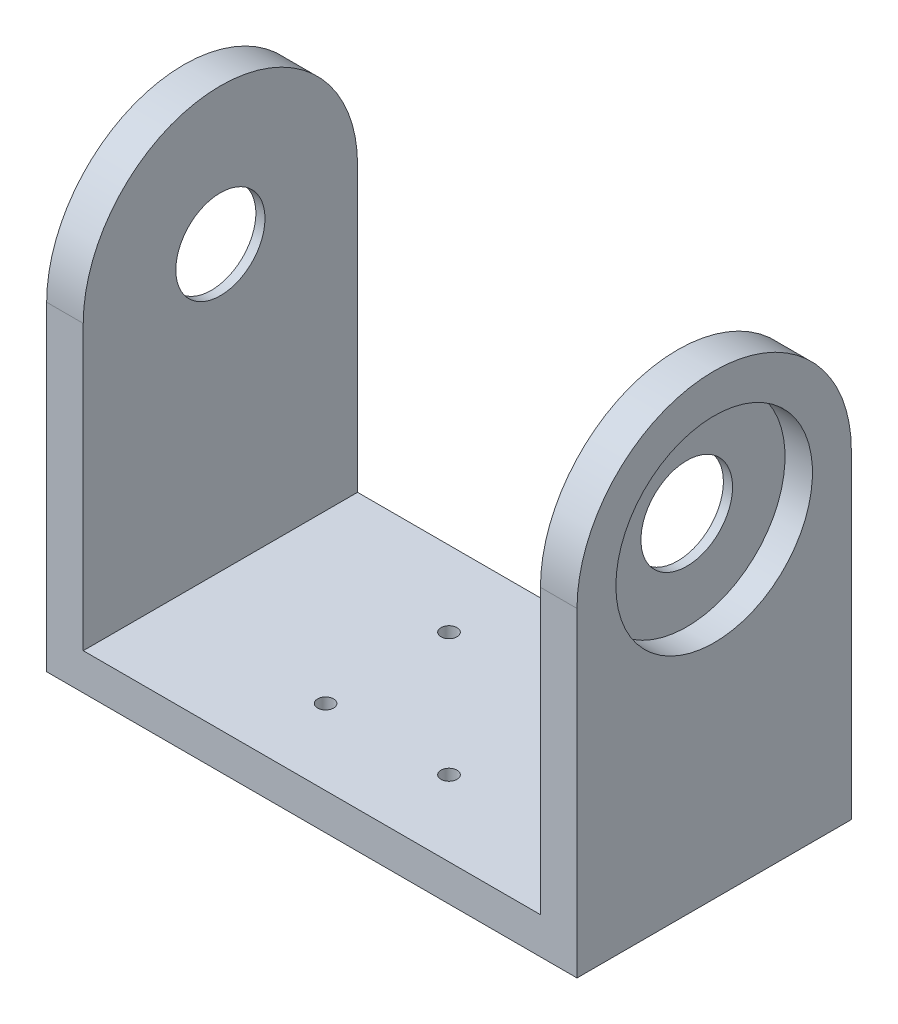
ISO-10303-21;
HEADER;
FILE_DESCRIPTION(('STEP AP214'),'2;1');
FILE_NAME('part.step','',(''),(''),'','','');
FILE_SCHEMA(('AUTOMOTIVE_DESIGN { 1 0 10303 214 1 1 1 1 }'));
ENDSEC;
DATA;
#1=APPLICATION_CONTEXT('core data for automotive mechanical design processes');
#2=APPLICATION_PROTOCOL_DEFINITION('international standard','automotive_design',2000,#1);
#3=PRODUCT_CONTEXT('',#1,'mechanical');
#4=PRODUCT('Part','Part','',(#3));
#5=PRODUCT_RELATED_PRODUCT_CATEGORY('part','',(#4));
#6=PRODUCT_DEFINITION_FORMATION('','',#4);
#7=PRODUCT_DEFINITION_CONTEXT('part definition',#1,'design');
#8=PRODUCT_DEFINITION('design','',#6,#7);
#9=PRODUCT_DEFINITION_SHAPE('','',#8);
#10=(LENGTH_UNIT() NAMED_UNIT(*) SI_UNIT(.MILLI.,.METRE.));
#11=(NAMED_UNIT(*) PLANE_ANGLE_UNIT() SI_UNIT($,.RADIAN.));
#12=(NAMED_UNIT(*) SI_UNIT($,.STERADIAN.) SOLID_ANGLE_UNIT());
#13=UNCERTAINTY_MEASURE_WITH_UNIT(LENGTH_MEASURE(1.E-05),#10,'distance_accuracy_value','');
#14=(GEOMETRIC_REPRESENTATION_CONTEXT(3) GLOBAL_UNCERTAINTY_ASSIGNED_CONTEXT((#13)) GLOBAL_UNIT_ASSIGNED_CONTEXT((#10,
#11,#12)) REPRESENTATION_CONTEXT('',''));
#15=CARTESIAN_POINT('',(0.,0.,0.));
#16=DIRECTION('',(0.,0.,1.));
#17=DIRECTION('',(1.,0.,0.));
#18=AXIS2_PLACEMENT_3D('',#15,#16,#17);
#19=CARTESIAN_POINT('',(29.,35.,0.));
#20=DIRECTION('',(-1.,0.,0.));
#21=DIRECTION('',(0.,0.,1.));
#22=AXIS2_PLACEMENT_3D('',#19,#20,#21);
#23=CYLINDRICAL_SURFACE('',#22,10.75);
#24=CARTESIAN_POINT('',(29.,35.,0.));
#25=DIRECTION('',(-1.,0.,0.));
#26=DIRECTION('',(0.,0.,1.));
#27=AXIS2_PLACEMENT_3D('',#24,#25,#26);
#28=CIRCLE('',#27,10.75);
#29=CARTESIAN_POINT('',(29.,35.,10.75));
#30=VERTEX_POINT('',#29);
#31=EDGE_CURVE('E151',#30,#30,#28,.T.);
#32=ORIENTED_EDGE('',*,*,#31,.F.);
#33=EDGE_LOOP('',(#32));
#34=FACE_BOUND('',#33,.T.);
#35=CARTESIAN_POINT('',(26.,35.,0.));
#36=DIRECTION('',(-1.,0.,0.));
#37=DIRECTION('',(0.,0.,1.));
#38=AXIS2_PLACEMENT_3D('',#35,#36,#37);
#39=CIRCLE('',#38,10.75);
#40=CARTESIAN_POINT('',(26.,35.,10.75));
#41=VERTEX_POINT('',#40);
#42=EDGE_CURVE('E11',#41,#41,#39,.F.);
#43=ORIENTED_EDGE('',*,*,#42,.F.);
#44=EDGE_LOOP('',(#43));
#45=FACE_BOUND('',#44,.T.);
#46=ADVANCED_FACE('F44',(#34,#45),#23,.F.);
#47=CARTESIAN_POINT('',(-29.,35.,0.));
#48=DIRECTION('',(1.,0.,0.));
#49=DIRECTION('',(0.,0.,-1.));
#50=AXIS2_PLACEMENT_3D('',#47,#48,#49);
#51=CYLINDRICAL_SURFACE('',#50,10.75);
#52=CARTESIAN_POINT('',(-29.,35.,0.));
#53=DIRECTION('',(-1.,0.,0.));
#54=DIRECTION('',(0.,0.,1.));
#55=AXIS2_PLACEMENT_3D('',#52,#53,#54);
#56=CIRCLE('',#55,10.75);
#57=CARTESIAN_POINT('',(-29.,35.,10.75));
#58=VERTEX_POINT('',#57);
#59=EDGE_CURVE('E161',#58,#58,#56,.T.);
#60=ORIENTED_EDGE('',*,*,#59,.T.);
#61=EDGE_LOOP('',(#60));
#62=FACE_BOUND('',#61,.T.);
#63=CARTESIAN_POINT('',(-26.,35.,0.));
#64=DIRECTION('',(1.,0.,0.));
#65=DIRECTION('',(0.,0.,-1.));
#66=AXIS2_PLACEMENT_3D('',#63,#64,#65);
#67=CIRCLE('',#66,10.75);
#68=CARTESIAN_POINT('',(-26.,35.,-10.75));
#69=VERTEX_POINT('',#68);
#70=EDGE_CURVE('E336',#69,#69,#67,.T.);
#71=ORIENTED_EDGE('',*,*,#70,.T.);
#72=EDGE_LOOP('',(#71));
#73=FACE_BOUND('',#72,.T.);
#74=ADVANCED_FACE('F241',(#62,#73),#51,.F.);
#75=CARTESIAN_POINT('',(-25.,4.,-15.));
#76=DIRECTION('',(0.,0.,1.));
#77=DIRECTION('',(1.,0.,0.));
#78=AXIS2_PLACEMENT_3D('',#75,#76,#77);
#79=PLANE('',#78);
#80=DIRECTION('',(-1.,0.,0.));
#81=VECTOR('',#80,1.);
#82=CARTESIAN_POINT('',(-25.,0.,-15.));
#83=LINE('',#82,#81);
#84=CARTESIAN_POINT('',(29.,0.,-15.));
#85=VERTEX_POINT('',#84);
#86=CARTESIAN_POINT('',(-29.,0.,-15.));
#87=VERTEX_POINT('',#86);
#88=EDGE_CURVE('E111',#85,#87,#83,.T.);
#89=ORIENTED_EDGE('',*,*,#88,.T.);
#90=DIRECTION('',(0.,-1.,0.));
#91=VECTOR('',#90,1.);
#92=CARTESIAN_POINT('',(-29.,0.,-15.));
#93=LINE('',#92,#91);
#94=CARTESIAN_POINT('',(-29.,35.,-15.));
#95=VERTEX_POINT('',#94);
#96=EDGE_CURVE('E174',#95,#87,#93,.T.);
#97=ORIENTED_EDGE('',*,*,#96,.F.);
#98=DIRECTION('',(1.,0.,0.));
#99=VECTOR('',#98,1.);
#100=CARTESIAN_POINT('',(-29.,35.,-15.));
#101=LINE('',#100,#99);
#102=CARTESIAN_POINT('',(-25.,35.,-15.));
#103=VERTEX_POINT('',#102);
#104=EDGE_CURVE('E177',#95,#103,#101,.T.);
#105=ORIENTED_EDGE('',*,*,#104,.T.);
#106=DIRECTION('',(0.,-1.,0.));
#107=VECTOR('',#106,1.);
#108=CARTESIAN_POINT('',(-25.,0.,-15.));
#109=LINE('',#108,#107);
#110=CARTESIAN_POINT('',(-25.,4.,-15.));
#111=VERTEX_POINT('',#110);
#112=EDGE_CURVE('E168',#103,#111,#109,.T.);
#113=ORIENTED_EDGE('',*,*,#112,.T.);
#114=DIRECTION('',(-1.,0.,0.));
#115=VECTOR('',#114,1.);
#116=CARTESIAN_POINT('',(-25.,4.,-15.));
#117=LINE('',#116,#115);
#118=CARTESIAN_POINT('',(25.,4.,-15.));
#119=VERTEX_POINT('',#118);
#120=EDGE_CURVE('E196',#119,#111,#117,.T.);
#121=ORIENTED_EDGE('',*,*,#120,.F.);
#122=DIRECTION('',(0.,-1.,0.));
#123=VECTOR('',#122,1.);
#124=CARTESIAN_POINT('',(25.,0.,-15.));
#125=LINE('',#124,#123);
#126=CARTESIAN_POINT('',(25.,35.,-15.));
#127=VERTEX_POINT('',#126);
#128=EDGE_CURVE('E68',#127,#119,#125,.T.);
#129=ORIENTED_EDGE('',*,*,#128,.F.);
#130=DIRECTION('',(-1.,0.,0.));
#131=VECTOR('',#130,1.);
#132=CARTESIAN_POINT('',(29.,35.,-15.));
#133=LINE('',#132,#131);
#134=CARTESIAN_POINT('',(29.,35.,-15.));
#135=VERTEX_POINT('',#134);
#136=EDGE_CURVE('E137',#135,#127,#133,.T.);
#137=ORIENTED_EDGE('',*,*,#136,.F.);
#138=DIRECTION('',(0.,-1.,0.));
#139=VECTOR('',#138,1.);
#140=CARTESIAN_POINT('',(29.,0.,-15.));
#141=LINE('',#140,#139);
#142=EDGE_CURVE('E130',#135,#85,#141,.T.);
#143=ORIENTED_EDGE('',*,*,#142,.T.);
#144=EDGE_LOOP('',(#89,#97,#105,#113,#121,#129,#137,#143));
#145=FACE_BOUND('',#144,.T.);
#146=ADVANCED_FACE('F46',(#145),#79,.F.);
#147=CARTESIAN_POINT('',(-25.,4.,15.));
#148=DIRECTION('',(0.,0.,-1.));
#149=DIRECTION('',(-1.,0.,0.));
#150=AXIS2_PLACEMENT_3D('',#147,#148,#149);
#151=PLANE('',#150);
#152=DIRECTION('',(1.,0.,0.));
#153=VECTOR('',#152,1.);
#154=CARTESIAN_POINT('',(-25.,0.,15.));
#155=LINE('',#154,#153);
#156=CARTESIAN_POINT('',(-29.,0.,15.));
#157=VERTEX_POINT('',#156);
#158=CARTESIAN_POINT('',(29.,0.,15.));
#159=VERTEX_POINT('',#158);
#160=EDGE_CURVE('E123',#157,#159,#155,.T.);
#161=ORIENTED_EDGE('',*,*,#160,.T.);
#162=DIRECTION('',(0.,1.,0.));
#163=VECTOR('',#162,1.);
#164=CARTESIAN_POINT('',(29.,35.,15.));
#165=LINE('',#164,#163);
#166=CARTESIAN_POINT('',(29.,35.,15.));
#167=VERTEX_POINT('',#166);
#168=EDGE_CURVE('E133',#159,#167,#165,.T.);
#169=ORIENTED_EDGE('',*,*,#168,.T.);
#170=DIRECTION('',(-1.,0.,0.));
#171=VECTOR('',#170,1.);
#172=CARTESIAN_POINT('',(29.,35.,15.));
#173=LINE('',#172,#171);
#174=CARTESIAN_POINT('',(25.,35.,15.));
#175=VERTEX_POINT('',#174);
#176=EDGE_CURVE('E147',#167,#175,#173,.T.);
#177=ORIENTED_EDGE('',*,*,#176,.T.);
#178=DIRECTION('',(0.,1.,0.));
#179=VECTOR('',#178,1.);
#180=CARTESIAN_POINT('',(25.,35.,15.));
#181=LINE('',#180,#179);
#182=CARTESIAN_POINT('',(25.,4.,15.));
#183=VERTEX_POINT('',#182);
#184=EDGE_CURVE('E135',#183,#175,#181,.T.);
#185=ORIENTED_EDGE('',*,*,#184,.F.);
#186=DIRECTION('',(1.,0.,0.));
#187=VECTOR('',#186,1.);
#188=CARTESIAN_POINT('',(-25.,4.,15.));
#189=LINE('',#188,#187);
#190=CARTESIAN_POINT('',(-25.,4.,15.));
#191=VERTEX_POINT('',#190);
#192=EDGE_CURVE('E53',#191,#183,#189,.T.);
#193=ORIENTED_EDGE('',*,*,#192,.F.);
#194=DIRECTION('',(0.,1.,0.));
#195=VECTOR('',#194,1.);
#196=CARTESIAN_POINT('',(-25.,35.,15.));
#197=LINE('',#196,#195);
#198=CARTESIAN_POINT('',(-25.,35.,15.));
#199=VERTEX_POINT('',#198);
#200=EDGE_CURVE('E60',#191,#199,#197,.T.);
#201=ORIENTED_EDGE('',*,*,#200,.T.);
#202=DIRECTION('',(1.,0.,0.));
#203=VECTOR('',#202,1.);
#204=CARTESIAN_POINT('',(-29.,35.,15.));
#205=LINE('',#204,#203);
#206=CARTESIAN_POINT('',(-29.,35.,15.));
#207=VERTEX_POINT('',#206);
#208=EDGE_CURVE('E124',#207,#199,#205,.T.);
#209=ORIENTED_EDGE('',*,*,#208,.F.);
#210=DIRECTION('',(0.,1.,0.));
#211=VECTOR('',#210,1.);
#212=CARTESIAN_POINT('',(-29.,35.,15.));
#213=LINE('',#212,#211);
#214=EDGE_CURVE('E167',#157,#207,#213,.T.);
#215=ORIENTED_EDGE('',*,*,#214,.F.);
#216=EDGE_LOOP('',(#161,#169,#177,#185,#193,#201,#209,#215));
#217=FACE_BOUND('',#216,.T.);
#218=ADVANCED_FACE('F208',(#217),#151,.F.);
#219=CARTESIAN_POINT('',(0.,4.,0.));
#220=DIRECTION('',(0.,1.,0.));
#221=DIRECTION('',(0.,0.,1.));
#222=AXIS2_PLACEMENT_3D('',#219,#220,#221);
#223=PLANE('',#222);
#224=CARTESIAN_POINT('',(-6.74999999999962,4.,-6.75));
#225=DIRECTION('',(0.,1.,0.));
#226=DIRECTION('',(0.,0.,1.));
#227=AXIS2_PLACEMENT_3D('',#224,#225,#226);
#228=CIRCLE('',#227,0.875000000000204);
#229=CARTESIAN_POINT('',(-6.74999999999962,4.,-5.8749999999998));
#230=VERTEX_POINT('',#229);
#231=EDGE_CURVE('E316',#230,#230,#228,.T.);
#232=ORIENTED_EDGE('',*,*,#231,.F.);
#233=EDGE_LOOP('',(#232));
#234=FACE_BOUND('',#233,.T.);
#235=CARTESIAN_POINT('',(6.75000000000038,4.,-6.74999999999962));
#236=DIRECTION('',(0.,1.,0.));
#237=DIRECTION('',(0.,0.,1.));
#238=AXIS2_PLACEMENT_3D('',#235,#236,#237);
#239=CIRCLE('',#238,0.875000000000535);
#240=CARTESIAN_POINT('',(6.75000000000038,4.,-5.87499999999909));
#241=VERTEX_POINT('',#240);
#242=EDGE_CURVE('E312',#241,#241,#239,.T.);
#243=ORIENTED_EDGE('',*,*,#242,.F.);
#244=EDGE_LOOP('',(#243));
#245=FACE_BOUND('',#244,.T.);
#246=CARTESIAN_POINT('',(6.75,4.,6.75000000000038));
#247=DIRECTION('',(0.,1.,0.));
#248=DIRECTION('',(0.,0.,1.));
#249=AXIS2_PLACEMENT_3D('',#246,#247,#248);
#250=CIRCLE('',#249,0.875000000000392);
#251=CARTESIAN_POINT('',(6.75,4.,7.62500000000077));
#252=VERTEX_POINT('',#251);
#253=EDGE_CURVE('E286',#252,#252,#250,.T.);
#254=ORIENTED_EDGE('',*,*,#253,.F.);
#255=EDGE_LOOP('',(#254));
#256=FACE_BOUND('',#255,.T.);
#257=CARTESIAN_POINT('',(-6.75,4.,6.75));
#258=DIRECTION('',(0.,1.,0.));
#259=DIRECTION('',(0.,0.,1.));
#260=AXIS2_PLACEMENT_3D('',#257,#258,#259);
#261=CIRCLE('',#260,0.875);
#262=CARTESIAN_POINT('',(-6.75,4.,7.625));
#263=VERTEX_POINT('',#262);
#264=EDGE_CURVE('E298',#263,#263,#261,.T.);
#265=ORIENTED_EDGE('',*,*,#264,.F.);
#266=EDGE_LOOP('',(#265));
#267=FACE_BOUND('',#266,.T.);
#268=DIRECTION('',(0.,0.,-1.));
#269=VECTOR('',#268,1.);
#270=CARTESIAN_POINT('',(25.,4.,-15.));
#271=LINE('',#270,#269);
#272=EDGE_CURVE('E192',#183,#119,#271,.T.);
#273=ORIENTED_EDGE('',*,*,#272,.T.);
#274=ORIENTED_EDGE('',*,*,#120,.T.);
#275=DIRECTION('',(0.,0.,1.));
#276=VECTOR('',#275,1.);
#277=CARTESIAN_POINT('',(-25.,4.,-15.));
#278=LINE('',#277,#276);
#279=EDGE_CURVE('E200',#111,#191,#278,.T.);
#280=ORIENTED_EDGE('',*,*,#279,.T.);
#281=ORIENTED_EDGE('',*,*,#192,.T.);
#282=EDGE_LOOP('',(#273,#274,#280,#281));
#283=FACE_BOUND('',#282,.T.);
#284=ADVANCED_FACE('F221',(#234,#245,#256,#267,#283),#223,.T.);
#285=CARTESIAN_POINT('',(0.,0.,0.));
#286=DIRECTION('',(0.,1.,0.));
#287=DIRECTION('',(0.,0.,1.));
#288=AXIS2_PLACEMENT_3D('',#285,#286,#287);
#289=PLANE('',#288);
#290=CARTESIAN_POINT('',(-6.74999999999962,0.,-6.75));
#291=DIRECTION('',(0.,-1.,0.));
#292=DIRECTION('',(0.,0.,-1.));
#293=AXIS2_PLACEMENT_3D('',#290,#291,#292);
#294=CIRCLE('',#293,0.875000000000204);
#295=CARTESIAN_POINT('',(-6.74999999999962,0.,-7.62500000000021));
#296=VERTEX_POINT('',#295);
#297=EDGE_CURVE('E301',#296,#296,#294,.T.);
#298=ORIENTED_EDGE('',*,*,#297,.F.);
#299=EDGE_LOOP('',(#298));
#300=FACE_BOUND('',#299,.T.);
#301=CARTESIAN_POINT('',(6.75000000000038,0.,-6.74999999999962));
#302=DIRECTION('',(0.,-1.,0.));
#303=DIRECTION('',(0.,0.,-1.));
#304=AXIS2_PLACEMENT_3D('',#301,#302,#303);
#305=CIRCLE('',#304,0.875000000000535);
#306=CARTESIAN_POINT('',(6.75000000000038,0.,-7.62500000000016));
#307=VERTEX_POINT('',#306);
#308=EDGE_CURVE('E293',#307,#307,#305,.T.);
#309=ORIENTED_EDGE('',*,*,#308,.F.);
#310=EDGE_LOOP('',(#309));
#311=FACE_BOUND('',#310,.T.);
#312=CARTESIAN_POINT('',(6.75,0.,6.75000000000038));
#313=DIRECTION('',(0.,-1.,0.));
#314=DIRECTION('',(0.,0.,-1.));
#315=AXIS2_PLACEMENT_3D('',#312,#313,#314);
#316=CIRCLE('',#315,0.875000000000392);
#317=CARTESIAN_POINT('',(6.75,0.,5.87499999999999));
#318=VERTEX_POINT('',#317);
#319=EDGE_CURVE('E289',#318,#318,#316,.T.);
#320=ORIENTED_EDGE('',*,*,#319,.F.);
#321=EDGE_LOOP('',(#320));
#322=FACE_BOUND('',#321,.T.);
#323=CARTESIAN_POINT('',(-6.75,0.,6.75));
#324=DIRECTION('',(0.,-1.,0.));
#325=DIRECTION('',(0.,0.,-1.));
#326=AXIS2_PLACEMENT_3D('',#323,#324,#325);
#327=CIRCLE('',#326,0.875);
#328=CARTESIAN_POINT('',(-6.75,0.,5.875));
#329=VERTEX_POINT('',#328);
#330=EDGE_CURVE('E292',#329,#329,#327,.T.);
#331=ORIENTED_EDGE('',*,*,#330,.F.);
#332=EDGE_LOOP('',(#331));
#333=FACE_BOUND('',#332,.T.);
#334=ORIENTED_EDGE('',*,*,#88,.F.);
#335=DIRECTION('',(0.,0.,1.));
#336=VECTOR('',#335,1.);
#337=CARTESIAN_POINT('',(29.,0.,-15.));
#338=LINE('',#337,#336);
#339=EDGE_CURVE('E114',#85,#159,#338,.T.);
#340=ORIENTED_EDGE('',*,*,#339,.T.);
#341=ORIENTED_EDGE('',*,*,#160,.F.);
#342=DIRECTION('',(0.,0.,1.));
#343=VECTOR('',#342,1.);
#344=CARTESIAN_POINT('',(-29.,0.,-15.));
#345=LINE('',#344,#343);
#346=EDGE_CURVE('E117',#87,#157,#345,.T.);
#347=ORIENTED_EDGE('',*,*,#346,.F.);
#348=EDGE_LOOP('',(#334,#340,#341,#347));
#349=FACE_BOUND('',#348,.T.);
#350=ADVANCED_FACE('F113',(#300,#311,#322,#333,#349),#289,.F.);
#351=CARTESIAN_POINT('',(-25.,35.,0.));
#352=DIRECTION('',(1.,0.,0.));
#353=DIRECTION('',(0.,0.,-1.));
#354=AXIS2_PLACEMENT_3D('',#351,#352,#353);
#355=PLANE('',#354);
#356=ORIENTED_EDGE('',*,*,#279,.F.);
#357=ORIENTED_EDGE('',*,*,#112,.F.);
#358=CARTESIAN_POINT('',(-25.,35.,0.));
#359=DIRECTION('',(-1.,0.,0.));
#360=DIRECTION('',(0.,0.,-1.));
#361=AXIS2_PLACEMENT_3D('',#358,#359,#360);
#362=CIRCLE('',#361,15.);
#363=EDGE_CURVE('E180',#199,#103,#362,.T.);
#364=ORIENTED_EDGE('',*,*,#363,.F.);
#365=ORIENTED_EDGE('',*,*,#200,.F.);
#366=EDGE_LOOP('',(#356,#357,#364,#365));
#367=FACE_BOUND('',#366,.T.);
#368=CARTESIAN_POINT('',(-25.,35.,0.));
#369=DIRECTION('',(1.,0.,0.));
#370=DIRECTION('',(0.,0.,-1.));
#371=AXIS2_PLACEMENT_3D('',#368,#369,#370);
#372=CIRCLE('',#371,4.875);
#373=CARTESIAN_POINT('',(-25.,35.,-4.87499999999999));
#374=VERTEX_POINT('',#373);
#375=EDGE_CURVE('E324',#374,#374,#372,.F.);
#376=ORIENTED_EDGE('',*,*,#375,.T.);
#377=EDGE_LOOP('',(#376));
#378=FACE_BOUND('',#377,.T.);
#379=ADVANCED_FACE('F217',(#367,#378),#355,.T.);
#380=CARTESIAN_POINT('',(-29.,35.,0.));
#381=DIRECTION('',(1.,0.,0.));
#382=DIRECTION('',(0.,0.,-1.));
#383=AXIS2_PLACEMENT_3D('',#380,#381,#382);
#384=PLANE('',#383);
#385=ORIENTED_EDGE('',*,*,#346,.T.);
#386=ORIENTED_EDGE('',*,*,#214,.T.);
#387=CARTESIAN_POINT('',(-29.,35.,0.));
#388=DIRECTION('',(-1.,0.,0.));
#389=DIRECTION('',(0.,0.,-1.));
#390=AXIS2_PLACEMENT_3D('',#387,#388,#389);
#391=CIRCLE('',#390,15.);
#392=EDGE_CURVE('E171',#207,#95,#391,.T.);
#393=ORIENTED_EDGE('',*,*,#392,.T.);
#394=ORIENTED_EDGE('',*,*,#96,.T.);
#395=EDGE_LOOP('',(#385,#386,#393,#394));
#396=FACE_BOUND('',#395,.T.);
#397=ORIENTED_EDGE('',*,*,#59,.F.);
#398=EDGE_LOOP('',(#397));
#399=FACE_BOUND('',#398,.T.);
#400=ADVANCED_FACE('F212',(#396,#399),#384,.F.);
#401=CARTESIAN_POINT('',(-29.,35.,0.));
#402=DIRECTION('',(1.,0.,0.));
#403=DIRECTION('',(0.,0.,-1.));
#404=AXIS2_PLACEMENT_3D('',#401,#402,#403);
#405=CYLINDRICAL_SURFACE('',#404,15.);
#406=ORIENTED_EDGE('',*,*,#363,.T.);
#407=ORIENTED_EDGE('',*,*,#104,.F.);
#408=ORIENTED_EDGE('',*,*,#392,.F.);
#409=ORIENTED_EDGE('',*,*,#208,.T.);
#410=EDGE_LOOP('',(#406,#407,#408,#409));
#411=FACE_BOUND('',#410,.T.);
#412=ADVANCED_FACE('F237',(#411),#405,.T.);
#413=CARTESIAN_POINT('',(25.,35.,0.));
#414=DIRECTION('',(-1.,0.,0.));
#415=DIRECTION('',(0.,0.,-1.));
#416=AXIS2_PLACEMENT_3D('',#413,#414,#415);
#417=PLANE('',#416);
#418=ORIENTED_EDGE('',*,*,#272,.F.);
#419=ORIENTED_EDGE('',*,*,#184,.T.);
#420=CARTESIAN_POINT('',(25.,35.,0.));
#421=DIRECTION('',(-1.,0.,0.));
#422=DIRECTION('',(0.,0.,-1.));
#423=AXIS2_PLACEMENT_3D('',#420,#421,#422);
#424=CIRCLE('',#423,15.);
#425=EDGE_CURVE('E150',#175,#127,#424,.T.);
#426=ORIENTED_EDGE('',*,*,#425,.T.);
#427=ORIENTED_EDGE('',*,*,#128,.T.);
#428=EDGE_LOOP('',(#418,#419,#426,#427));
#429=FACE_BOUND('',#428,.T.);
#430=CARTESIAN_POINT('',(25.,35.,0.));
#431=DIRECTION('',(-1.,0.,0.));
#432=DIRECTION('',(0.,0.,1.));
#433=AXIS2_PLACEMENT_3D('',#430,#431,#432);
#434=CIRCLE('',#433,5.01);
#435=CARTESIAN_POINT('',(25.,35.,5.01));
#436=VERTEX_POINT('',#435);
#437=EDGE_CURVE('E332',#436,#436,#434,.F.);
#438=ORIENTED_EDGE('',*,*,#437,.T.);
#439=EDGE_LOOP('',(#438));
#440=FACE_BOUND('',#439,.T.);
#441=ADVANCED_FACE('F224',(#429,#440),#417,.T.);
#442=CARTESIAN_POINT('',(29.,35.,0.));
#443=DIRECTION('',(-1.,0.,0.));
#444=DIRECTION('',(0.,0.,1.));
#445=AXIS2_PLACEMENT_3D('',#442,#443,#444);
#446=CYLINDRICAL_SURFACE('',#445,15.);
#447=ORIENTED_EDGE('',*,*,#425,.F.);
#448=ORIENTED_EDGE('',*,*,#176,.F.);
#449=CARTESIAN_POINT('',(29.,35.,0.));
#450=DIRECTION('',(-1.,0.,0.));
#451=DIRECTION('',(0.,0.,-1.));
#452=AXIS2_PLACEMENT_3D('',#449,#450,#451);
#453=CIRCLE('',#452,15.);
#454=EDGE_CURVE('E139',#167,#135,#453,.T.);
#455=ORIENTED_EDGE('',*,*,#454,.T.);
#456=ORIENTED_EDGE('',*,*,#136,.T.);
#457=EDGE_LOOP('',(#447,#448,#455,#456));
#458=FACE_BOUND('',#457,.T.);
#459=ADVANCED_FACE('F227',(#458),#446,.T.);
#460=CARTESIAN_POINT('',(29.,35.,0.));
#461=DIRECTION('',(-1.,0.,0.));
#462=DIRECTION('',(0.,0.,-1.));
#463=AXIS2_PLACEMENT_3D('',#460,#461,#462);
#464=PLANE('',#463);
#465=ORIENTED_EDGE('',*,*,#31,.T.);
#466=EDGE_LOOP('',(#465));
#467=FACE_BOUND('',#466,.T.);
#468=ORIENTED_EDGE('',*,*,#339,.F.);
#469=ORIENTED_EDGE('',*,*,#142,.F.);
#470=ORIENTED_EDGE('',*,*,#454,.F.);
#471=ORIENTED_EDGE('',*,*,#168,.F.);
#472=EDGE_LOOP('',(#468,#469,#470,#471));
#473=FACE_BOUND('',#472,.T.);
#474=ADVANCED_FACE('F128',(#467,#473),#464,.F.);
#475=CARTESIAN_POINT('',(-26.,35.,0.));
#476=DIRECTION('',(1.,0.,0.));
#477=DIRECTION('',(0.,0.,-1.));
#478=AXIS2_PLACEMENT_3D('',#475,#476,#477);
#479=PLANE('',#478);
#480=ORIENTED_EDGE('',*,*,#70,.F.);
#481=EDGE_LOOP('',(#480));
#482=FACE_BOUND('',#481,.T.);
#483=CARTESIAN_POINT('',(-26.,35.,0.));
#484=DIRECTION('',(-1.,0.,0.));
#485=DIRECTION('',(0.,0.,1.));
#486=AXIS2_PLACEMENT_3D('',#483,#484,#485);
#487=CIRCLE('',#486,4.875);
#488=CARTESIAN_POINT('',(-26.,35.,4.87500000000001));
#489=VERTEX_POINT('',#488);
#490=EDGE_CURVE('E320',#489,#489,#487,.T.);
#491=ORIENTED_EDGE('',*,*,#490,.F.);
#492=EDGE_LOOP('',(#491));
#493=FACE_BOUND('',#492,.T.);
#494=ADVANCED_FACE('F234',(#482,#493),#479,.F.);
#495=CARTESIAN_POINT('',(26.,35.,0.));
#496=DIRECTION('',(-1.,0.,0.));
#497=DIRECTION('',(0.,0.,-1.));
#498=AXIS2_PLACEMENT_3D('',#495,#496,#497);
#499=PLANE('',#498);
#500=ORIENTED_EDGE('',*,*,#42,.T.);
#501=EDGE_LOOP('',(#500));
#502=FACE_BOUND('',#501,.T.);
#503=CARTESIAN_POINT('',(26.,35.,0.));
#504=DIRECTION('',(1.,0.,0.));
#505=DIRECTION('',(0.,0.,-1.));
#506=AXIS2_PLACEMENT_3D('',#503,#504,#505);
#507=CIRCLE('',#506,5.01);
#508=CARTESIAN_POINT('',(26.,35.,-5.01));
#509=VERTEX_POINT('',#508);
#510=EDGE_CURVE('E328',#509,#509,#507,.T.);
#511=ORIENTED_EDGE('',*,*,#510,.F.);
#512=EDGE_LOOP('',(#511));
#513=FACE_BOUND('',#512,.T.);
#514=ADVANCED_FACE('F253',(#502,#513),#499,.F.);
#515=CARTESIAN_POINT('',(7.32233047033632,35.,0.));
#516=DIRECTION('',(1.,0.,0.));
#517=DIRECTION('',(0.,0.,-1.));
#518=AXIS2_PLACEMENT_3D('',#515,#516,#517);
#519=CYLINDRICAL_SURFACE('',#518,5.01);
#520=ORIENTED_EDGE('',*,*,#510,.T.);
#521=EDGE_LOOP('',(#520));
#522=FACE_BOUND('',#521,.T.);
#523=ORIENTED_EDGE('',*,*,#437,.F.);
#524=EDGE_LOOP('',(#523));
#525=FACE_BOUND('',#524,.T.);
#526=ADVANCED_FACE('F257',(#522,#525),#519,.F.);
#527=CARTESIAN_POINT('',(-7.32233047033632,35.,0.));
#528=DIRECTION('',(-1.,0.,0.));
#529=DIRECTION('',(0.,0.,1.));
#530=AXIS2_PLACEMENT_3D('',#527,#528,#529);
#531=CYLINDRICAL_SURFACE('',#530,4.875);
#532=ORIENTED_EDGE('',*,*,#490,.T.);
#533=EDGE_LOOP('',(#532));
#534=FACE_BOUND('',#533,.T.);
#535=ORIENTED_EDGE('',*,*,#375,.F.);
#536=EDGE_LOOP('',(#535));
#537=FACE_BOUND('',#536,.T.);
#538=ADVANCED_FACE('F261',(#534,#537),#531,.F.);
#539=CARTESIAN_POINT('',(-6.75,10.,6.75));
#540=DIRECTION('',(0.,-1.,0.));
#541=DIRECTION('',(0.,0.,-1.));
#542=AXIS2_PLACEMENT_3D('',#539,#540,#541);
#543=CYLINDRICAL_SURFACE('',#542,0.875);
#544=ORIENTED_EDGE('',*,*,#264,.T.);
#545=EDGE_LOOP('',(#544));
#546=FACE_BOUND('',#545,.T.);
#547=ORIENTED_EDGE('',*,*,#330,.T.);
#548=EDGE_LOOP('',(#547));
#549=FACE_BOUND('',#548,.T.);
#550=ADVANCED_FACE('F265',(#546,#549),#543,.F.);
#551=CARTESIAN_POINT('',(6.75,10.,6.75000000000038));
#552=DIRECTION('',(0.,-1.,0.));
#553=DIRECTION('',(0.,0.,-1.));
#554=AXIS2_PLACEMENT_3D('',#551,#552,#553);
#555=CYLINDRICAL_SURFACE('',#554,0.875000000000392);
#556=ORIENTED_EDGE('',*,*,#253,.T.);
#557=EDGE_LOOP('',(#556));
#558=FACE_BOUND('',#557,.T.);
#559=ORIENTED_EDGE('',*,*,#319,.T.);
#560=EDGE_LOOP('',(#559));
#561=FACE_BOUND('',#560,.T.);
#562=ADVANCED_FACE('F269',(#558,#561),#555,.F.);
#563=CARTESIAN_POINT('',(6.75000000000038,10.,-6.74999999999962));
#564=DIRECTION('',(0.,-1.,0.));
#565=DIRECTION('',(0.,0.,-1.));
#566=AXIS2_PLACEMENT_3D('',#563,#564,#565);
#567=CYLINDRICAL_SURFACE('',#566,0.875000000000535);
#568=ORIENTED_EDGE('',*,*,#242,.T.);
#569=EDGE_LOOP('',(#568));
#570=FACE_BOUND('',#569,.T.);
#571=ORIENTED_EDGE('',*,*,#308,.T.);
#572=EDGE_LOOP('',(#571));
#573=FACE_BOUND('',#572,.T.);
#574=ADVANCED_FACE('F274',(#570,#573),#567,.F.);
#575=CARTESIAN_POINT('',(-6.74999999999962,10.,-6.75));
#576=DIRECTION('',(0.,-1.,0.));
#577=DIRECTION('',(0.,0.,-1.));
#578=AXIS2_PLACEMENT_3D('',#575,#576,#577);
#579=CYLINDRICAL_SURFACE('',#578,0.875000000000204);
#580=ORIENTED_EDGE('',*,*,#231,.T.);
#581=EDGE_LOOP('',(#580));
#582=FACE_BOUND('',#581,.T.);
#583=ORIENTED_EDGE('',*,*,#297,.T.);
#584=EDGE_LOOP('',(#583));
#585=FACE_BOUND('',#584,.T.);
#586=ADVANCED_FACE('F271',(#582,#585),#579,.F.);
#587=CLOSED_SHELL('',(#46,#74,#146,#218,#284,#350,#379,#400,#412,#441,#459,#474,#494,#514,#526,
#538,#550,#562,#574,#586));
#588=MANIFOLD_SOLID_BREP('B2',#587);
#589=ADVANCED_BREP_SHAPE_REPRESENTATION('',(#18,#588),#14);
#590=SHAPE_DEFINITION_REPRESENTATION(#9,#589);
ENDSEC;
END-ISO-10303-21;
